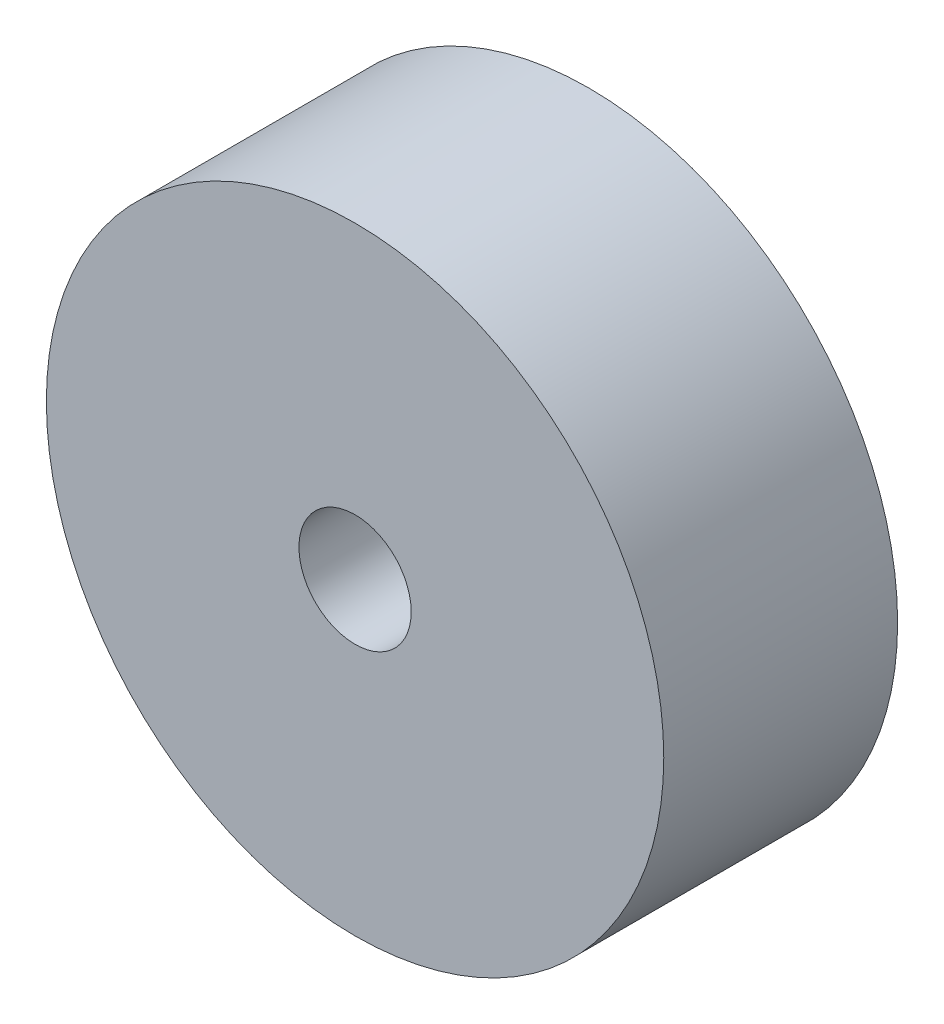
ISO-10303-21;
HEADER;
FILE_DESCRIPTION(('STEP AP214'),'2;1');
FILE_NAME('part.step','',(''),(''),'','','');
FILE_SCHEMA(('AUTOMOTIVE_DESIGN { 1 0 10303 214 1 1 1 1 }'));
ENDSEC;
DATA;
#1=APPLICATION_CONTEXT('core data for automotive mechanical design processes');
#2=APPLICATION_PROTOCOL_DEFINITION('international standard','automotive_design',2000,#1);
#3=PRODUCT_CONTEXT('',#1,'mechanical');
#4=PRODUCT('Part','Part','',(#3));
#5=PRODUCT_RELATED_PRODUCT_CATEGORY('part','',(#4));
#6=PRODUCT_DEFINITION_FORMATION('','',#4);
#7=PRODUCT_DEFINITION_CONTEXT('part definition',#1,'design');
#8=PRODUCT_DEFINITION('design','',#6,#7);
#9=PRODUCT_DEFINITION_SHAPE('','',#8);
#10=(LENGTH_UNIT() NAMED_UNIT(*) SI_UNIT(.MILLI.,.METRE.));
#11=(NAMED_UNIT(*) PLANE_ANGLE_UNIT() SI_UNIT($,.RADIAN.));
#12=(NAMED_UNIT(*) SI_UNIT($,.STERADIAN.) SOLID_ANGLE_UNIT());
#13=UNCERTAINTY_MEASURE_WITH_UNIT(LENGTH_MEASURE(1.E-05),#10,'distance_accuracy_value','');
#14=(GEOMETRIC_REPRESENTATION_CONTEXT(3) GLOBAL_UNCERTAINTY_ASSIGNED_CONTEXT((#13)) GLOBAL_UNIT_ASSIGNED_CONTEXT((#10,
#11,#12)) REPRESENTATION_CONTEXT('',''));
#15=CARTESIAN_POINT('',(0.,0.,0.));
#16=DIRECTION('',(0.,0.,1.));
#17=DIRECTION('',(1.,0.,0.));
#18=AXIS2_PLACEMENT_3D('',#15,#16,#17);
#19=CARTESIAN_POINT('',(0.,0.,-25.));
#20=DIRECTION('',(0.,0.,1.));
#21=DIRECTION('',(1.,0.,0.));
#22=AXIS2_PLACEMENT_3D('',#19,#20,#21);
#23=CYLINDRICAL_SURFACE('',#22,33.);
#24=CARTESIAN_POINT('',(0.,0.,-25.));
#25=DIRECTION('',(0.,0.,1.));
#26=DIRECTION('',(1.,0.,0.));
#27=AXIS2_PLACEMENT_3D('',#24,#25,#26);
#28=CIRCLE('',#27,33.);
#29=CARTESIAN_POINT('',(33.,0.,-25.));
#30=VERTEX_POINT('',#29);
#31=EDGE_CURVE('E10',#30,#30,#28,.T.);
#32=ORIENTED_EDGE('',*,*,#31,.T.);
#33=EDGE_LOOP('',(#32));
#34=FACE_BOUND('',#33,.T.);
#35=CARTESIAN_POINT('',(0.,0.,0.));
#36=DIRECTION('',(0.,0.,1.));
#37=DIRECTION('',(1.,0.,0.));
#38=AXIS2_PLACEMENT_3D('',#35,#36,#37);
#39=CIRCLE('',#38,33.);
#40=CARTESIAN_POINT('',(33.,0.,0.));
#41=VERTEX_POINT('',#40);
#42=EDGE_CURVE('E45',#41,#41,#39,.T.);
#43=ORIENTED_EDGE('',*,*,#42,.F.);
#44=EDGE_LOOP('',(#43));
#45=FACE_BOUND('',#44,.T.);
#46=ADVANCED_FACE('F39',(#34,#45),#23,.T.);
#47=CARTESIAN_POINT('',(0.,0.,-25.));
#48=DIRECTION('',(0.,0.,1.));
#49=DIRECTION('',(1.,0.,0.));
#50=AXIS2_PLACEMENT_3D('',#47,#48,#49);
#51=PLANE('',#50);
#52=CARTESIAN_POINT('',(0.,0.,-25.));
#53=DIRECTION('',(0.,0.,1.));
#54=DIRECTION('',(1.,0.,0.));
#55=AXIS2_PLACEMENT_3D('',#52,#53,#54);
#56=CIRCLE('',#55,6.);
#57=CARTESIAN_POINT('',(6.,0.,-25.));
#58=VERTEX_POINT('',#57);
#59=EDGE_CURVE('E47',#58,#58,#56,.T.);
#60=ORIENTED_EDGE('',*,*,#59,.T.);
#61=EDGE_LOOP('',(#60));
#62=FACE_BOUND('',#61,.T.);
#63=ORIENTED_EDGE('',*,*,#31,.F.);
#64=EDGE_LOOP('',(#63));
#65=FACE_BOUND('',#64,.T.);
#66=ADVANCED_FACE('F60',(#62,#65),#51,.F.);
#67=CARTESIAN_POINT('',(0.,0.,0.));
#68=DIRECTION('',(0.,0.,1.));
#69=DIRECTION('',(1.,0.,0.));
#70=AXIS2_PLACEMENT_3D('',#67,#68,#69);
#71=PLANE('',#70);
#72=CARTESIAN_POINT('',(0.,0.,0.));
#73=DIRECTION('',(0.,0.,1.));
#74=DIRECTION('',(1.,0.,0.));
#75=AXIS2_PLACEMENT_3D('',#72,#73,#74);
#76=CIRCLE('',#75,6.);
#77=CARTESIAN_POINT('',(6.,0.,0.));
#78=VERTEX_POINT('',#77);
#79=EDGE_CURVE('E51',#78,#78,#76,.T.);
#80=ORIENTED_EDGE('',*,*,#79,.F.);
#81=EDGE_LOOP('',(#80));
#82=FACE_BOUND('',#81,.T.);
#83=ORIENTED_EDGE('',*,*,#42,.T.);
#84=EDGE_LOOP('',(#83));
#85=FACE_BOUND('',#84,.T.);
#86=ADVANCED_FACE('F63',(#82,#85),#71,.T.);
#87=CARTESIAN_POINT('',(0.,0.,-25.));
#88=DIRECTION('',(0.,0.,1.));
#89=DIRECTION('',(1.,0.,0.));
#90=AXIS2_PLACEMENT_3D('',#87,#88,#89);
#91=CYLINDRICAL_SURFACE('',#90,6.);
#92=ORIENTED_EDGE('',*,*,#59,.F.);
#93=EDGE_LOOP('',(#92));
#94=FACE_BOUND('',#93,.T.);
#95=ORIENTED_EDGE('',*,*,#79,.T.);
#96=EDGE_LOOP('',(#95));
#97=FACE_BOUND('',#96,.T.);
#98=ADVANCED_FACE('F58',(#94,#97),#91,.F.);
#99=CLOSED_SHELL('',(#46,#66,#86,#98));
#100=MANIFOLD_SOLID_BREP('B2',#99);
#101=ADVANCED_BREP_SHAPE_REPRESENTATION('',(#18,#100),#14);
#102=SHAPE_DEFINITION_REPRESENTATION(#9,#101);
ENDSEC;
END-ISO-10303-21;
